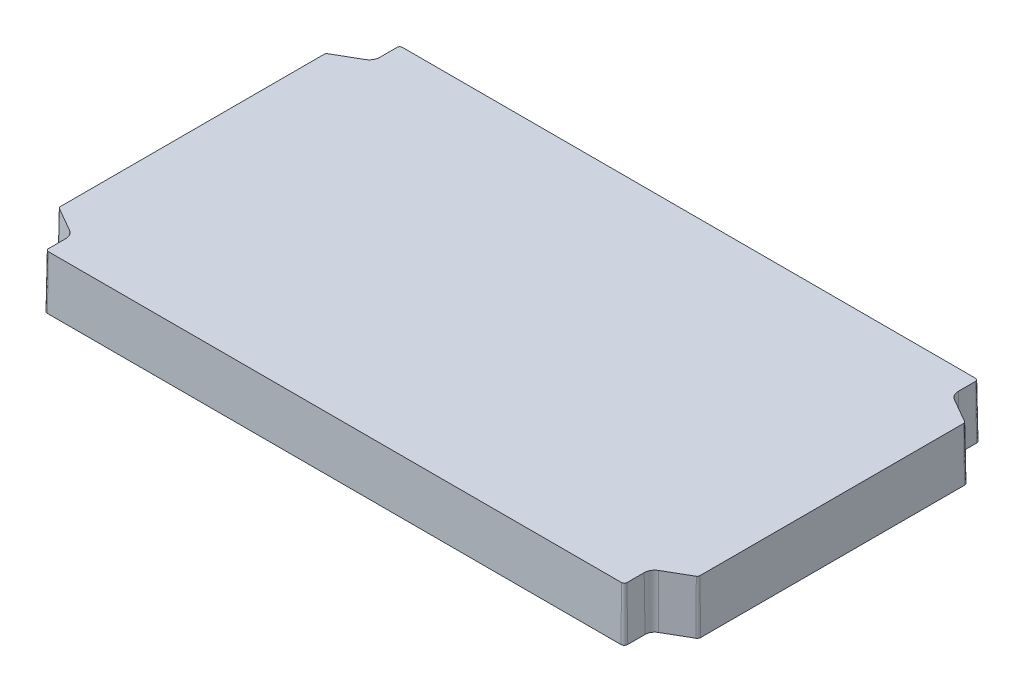
ISO-10303-21;
HEADER;
FILE_DESCRIPTION(('STEP AP214'),'2;1');
FILE_NAME('part.step','',(''),(''),'','','');
FILE_SCHEMA(('AUTOMOTIVE_DESIGN { 1 0 10303 214 1 1 1 1 }'));
ENDSEC;
DATA;
#1=APPLICATION_CONTEXT('core data for automotive mechanical design processes');
#2=APPLICATION_PROTOCOL_DEFINITION('international standard','automotive_design',2000,#1);
#3=PRODUCT_CONTEXT('',#1,'mechanical');
#4=PRODUCT('Part','Part','',(#3));
#5=PRODUCT_RELATED_PRODUCT_CATEGORY('part','',(#4));
#6=PRODUCT_DEFINITION_FORMATION('','',#4);
#7=PRODUCT_DEFINITION_CONTEXT('part definition',#1,'design');
#8=PRODUCT_DEFINITION('design','',#6,#7);
#9=PRODUCT_DEFINITION_SHAPE('','',#8);
#10=(LENGTH_UNIT() NAMED_UNIT(*) SI_UNIT(.MILLI.,.METRE.));
#11=(NAMED_UNIT(*) PLANE_ANGLE_UNIT() SI_UNIT($,.RADIAN.));
#12=(NAMED_UNIT(*) SI_UNIT($,.STERADIAN.) SOLID_ANGLE_UNIT());
#13=UNCERTAINTY_MEASURE_WITH_UNIT(LENGTH_MEASURE(1.E-05),#10,'distance_accuracy_value','');
#14=(GEOMETRIC_REPRESENTATION_CONTEXT(3) GLOBAL_UNCERTAINTY_ASSIGNED_CONTEXT((#13)) GLOBAL_UNIT_ASSIGNED_CONTEXT((#10,
#11,#12)) REPRESENTATION_CONTEXT('',''));
#15=CARTESIAN_POINT('',(0.,0.,0.));
#16=DIRECTION('',(0.,0.,1.));
#17=DIRECTION('',(1.,0.,0.));
#18=AXIS2_PLACEMENT_3D('',#15,#16,#17);
#19=CARTESIAN_POINT('',(134.996749371851,-37.5520685347959,82.1212644756854));
#20=DIRECTION('',(0.,-1.,0.));
#21=DIRECTION('',(0.,0.,-1.));
#22=AXIS2_PLACEMENT_3D('',#19,#20,#21);
#23=CONICAL_SURFACE('',#22,1.21452207822979,0.017453292519956);
#24=CARTESIAN_POINT('',(134.996749371851,-37.5520685347959,82.1212644756854));
#25=DIRECTION('',(0.,1.,0.));
#26=DIRECTION('',(0.,0.,-1.));
#27=AXIS2_PLACEMENT_3D('',#24,#25,#26);
#28=CIRCLE('',#27,1.21452207822979);
#29=CARTESIAN_POINT('',(134.996749371851,-37.5520685347959,83.3357865539152));
#30=VERTEX_POINT('',#29);
#31=CARTESIAN_POINT('',(136.211271450081,-37.5520685347959,82.1212644756854));
#32=VERTEX_POINT('',#31);
#33=EDGE_CURVE('E239',#30,#32,#28,.T.);
#34=ORIENTED_EDGE('',*,*,#33,.F.);
#35=DIRECTION('',(0.,-0.999847695156391,0.0174524064372962));
#36=VECTOR('',#35,1.);
#37=CARTESIAN_POINT('',(134.996749371851,-37.5520685347959,83.3357865539152));
#38=LINE('',#37,#36);
#39=CARTESIAN_POINT('',(134.996749371851,-62.5520685348215,83.7721631771214));
#40=VERTEX_POINT('',#39);
#41=EDGE_CURVE('E11',#40,#30,#38,.F.);
#42=ORIENTED_EDGE('',*,*,#41,.F.);
#43=CARTESIAN_POINT('',(134.996749371851,-62.5520685348215,82.1212644756854));
#44=DIRECTION('',(0.,-1.,0.));
#45=DIRECTION('',(0.,0.,-1.));
#46=AXIS2_PLACEMENT_3D('',#43,#44,#45);
#47=CIRCLE('',#46,1.65089870143599);
#48=CARTESIAN_POINT('',(136.647648073287,-62.5520685348215,82.1212644756854));
#49=VERTEX_POINT('',#48);
#50=EDGE_CURVE('E241',#40,#49,#47,.F.);
#51=ORIENTED_EDGE('',*,*,#50,.T.);
#52=DIRECTION('',(0.0174524064372962,-0.999847695156391,0.));
#53=VECTOR('',#52,1.);
#54=CARTESIAN_POINT('',(136.211271450081,-37.5520685347959,82.1212644756854));
#55=LINE('',#54,#53);
#56=EDGE_CURVE('E157',#49,#32,#55,.F.);
#57=ORIENTED_EDGE('',*,*,#56,.T.);
#58=EDGE_LOOP('',(#34,#42,#51,#57));
#59=FACE_BOUND('',#58,.T.);
#60=ADVANCED_FACE('F49',(#59),#23,.T.);
#61=CARTESIAN_POINT('',(-134.996749371851,-37.5520685347959,83.3357865539152));
#62=DIRECTION('',(0.,0.0174524064372962,0.999847695156391));
#63=DIRECTION('',(0.,-0.999847695156391,0.0174524064372962));
#64=AXIS2_PLACEMENT_3D('',#61,#62,#63);
#65=PLANE('',#64);
#66=DIRECTION('',(1.,0.,0.));
#67=VECTOR('',#66,1.);
#68=CARTESIAN_POINT('',(-134.996749371851,-37.5520685347959,83.3357865539152));
#69=LINE('',#68,#67);
#70=CARTESIAN_POINT('',(-134.996749371851,-37.5520685347959,83.3357865539152));
#71=VERTEX_POINT('',#70);
#72=EDGE_CURVE('E254',#71,#30,#69,.T.);
#73=ORIENTED_EDGE('',*,*,#72,.F.);
#74=DIRECTION('',(0.,-0.999847695156391,0.0174524064372962));
#75=VECTOR('',#74,1.);
#76=CARTESIAN_POINT('',(-134.996749371851,-37.5520685347959,83.3357865539152));
#77=LINE('',#76,#75);
#78=CARTESIAN_POINT('',(-134.996749371851,-62.5520685348215,83.7721631771214));
#79=VERTEX_POINT('',#78);
#80=EDGE_CURVE('E53',#79,#71,#77,.F.);
#81=ORIENTED_EDGE('',*,*,#80,.F.);
#82=DIRECTION('',(1.,0.,0.));
#83=VECTOR('',#82,1.);
#84=CARTESIAN_POINT('',(-134.996749371851,-62.5520685348215,83.7721631771214));
#85=LINE('',#84,#83);
#86=EDGE_CURVE('E243',#79,#40,#85,.T.);
#87=ORIENTED_EDGE('',*,*,#86,.T.);
#88=ORIENTED_EDGE('',*,*,#41,.T.);
#89=EDGE_LOOP('',(#73,#81,#87,#88));
#90=FACE_BOUND('',#89,.T.);
#91=ADVANCED_FACE('F51',(#90),#65,.T.);
#92=CARTESIAN_POINT('',(-134.996749371851,-37.5520685347959,82.1212644756855));
#93=DIRECTION('',(0.,-1.,0.));
#94=DIRECTION('',(0.,0.,1.));
#95=AXIS2_PLACEMENT_3D('',#92,#93,#94);
#96=CONICAL_SURFACE('',#95,1.21452207822979,0.017453292519956);
#97=CARTESIAN_POINT('',(-134.996749371851,-37.5520685347959,82.1212644756855));
#98=DIRECTION('',(0.,1.,0.));
#99=DIRECTION('',(0.,0.,1.));
#100=AXIS2_PLACEMENT_3D('',#97,#98,#99);
#101=CIRCLE('',#100,1.21452207822979);
#102=CARTESIAN_POINT('',(-136.211271450081,-37.5520685347959,82.1212644756855));
#103=VERTEX_POINT('',#102);
#104=EDGE_CURVE('E336',#103,#71,#101,.T.);
#105=ORIENTED_EDGE('',*,*,#104,.F.);
#106=DIRECTION('',(-0.0174524064372962,-0.999847695156391,0.));
#107=VECTOR('',#106,1.);
#108=CARTESIAN_POINT('',(-136.211271450081,-37.5520685347959,82.1212644756855));
#109=LINE('',#108,#107);
#110=CARTESIAN_POINT('',(-136.647648073287,-62.5520685348215,82.1212644756855));
#111=VERTEX_POINT('',#110);
#112=EDGE_CURVE('E488',#111,#103,#109,.F.);
#113=ORIENTED_EDGE('',*,*,#112,.F.);
#114=CARTESIAN_POINT('',(-134.996749371851,-62.5520685348215,82.1212644756855));
#115=DIRECTION('',(0.,-1.,0.));
#116=DIRECTION('',(0.,0.,-1.));
#117=AXIS2_PLACEMENT_3D('',#114,#115,#116);
#118=CIRCLE('',#117,1.65089870143599);
#119=EDGE_CURVE('E346',#111,#79,#118,.F.);
#120=ORIENTED_EDGE('',*,*,#119,.T.);
#121=ORIENTED_EDGE('',*,*,#80,.T.);
#122=EDGE_LOOP('',(#105,#113,#120,#121));
#123=FACE_BOUND('',#122,.T.);
#124=ADVANCED_FACE('F496',(#123),#96,.T.);
#125=CARTESIAN_POINT('',(-136.211271450081,-37.5520685347959,73.9747215204799));
#126=DIRECTION('',(-0.999847695156391,0.0174524064372962,0.));
#127=DIRECTION('',(-0.0174524064372962,-0.999847695156391,0.));
#128=AXIS2_PLACEMENT_3D('',#125,#126,#127);
#129=PLANE('',#128);
#130=DIRECTION('',(0.,0.,1.));
#131=VECTOR('',#130,1.);
#132=CARTESIAN_POINT('',(-136.211271450081,-37.5520685347959,73.9747215204799));
#133=LINE('',#132,#131);
#134=CARTESIAN_POINT('',(-136.211271450081,-37.5520685347959,73.9747215204799));
#135=VERTEX_POINT('',#134);
#136=EDGE_CURVE('E332',#135,#103,#133,.T.);
#137=ORIENTED_EDGE('',*,*,#136,.F.);
#138=DIRECTION('',(-0.0174524064372962,-0.999847695156391,0.));
#139=VECTOR('',#138,1.);
#140=CARTESIAN_POINT('',(-136.211271450081,-37.5520685347959,73.9747215204799));
#141=LINE('',#140,#139);
#142=CARTESIAN_POINT('',(-136.647648073287,-62.5520685348215,73.9747215204799));
#143=VERTEX_POINT('',#142);
#144=EDGE_CURVE('E486',#143,#135,#141,.F.);
#145=ORIENTED_EDGE('',*,*,#144,.F.);
#146=DIRECTION('',(0.,0.,1.));
#147=VECTOR('',#146,1.);
#148=CARTESIAN_POINT('',(-136.647648073287,-62.5520685348215,73.9747215204799));
#149=LINE('',#148,#147);
#150=EDGE_CURVE('E349',#143,#111,#149,.T.);
#151=ORIENTED_EDGE('',*,*,#150,.T.);
#152=ORIENTED_EDGE('',*,*,#112,.T.);
#153=EDGE_LOOP('',(#137,#145,#151,#152));
#154=FACE_BOUND('',#153,.T.);
#155=ADVANCED_FACE('F493',(#154),#129,.T.);
#156=CARTESIAN_POINT('',(-141.194748953033,-37.5520685347959,73.9747215204799));
#157=DIRECTION('',(0.,1.,0.));
#158=DIRECTION('',(0.,0.,-1.));
#159=AXIS2_PLACEMENT_3D('',#156,#157,#158);
#160=CONICAL_SURFACE('',#159,4.98347750295221,0.017453292519956);
#161=CARTESIAN_POINT('',(-141.194748953033,-37.5520685347959,73.9747215204799));
#162=DIRECTION('',(0.,-1.,0.));
#163=DIRECTION('',(0.,0.,-1.));
#164=AXIS2_PLACEMENT_3D('',#161,#162,#163);
#165=CIRCLE('',#164,4.98347750295221);
#166=CARTESIAN_POINT('',(-138.703010201557,-37.5520685347959,69.6589034037349));
#167=VERTEX_POINT('',#166);
#168=EDGE_CURVE('E328',#167,#135,#165,.T.);
#169=ORIENTED_EDGE('',*,*,#168,.F.);
#170=DIRECTION('',(-0.00872620321864806,-0.999847695156391,0.0151142273318696));
#171=VECTOR('',#170,1.);
#172=CARTESIAN_POINT('',(-138.703010201557,-37.5520685347959,69.6589034037349));
#173=LINE('',#172,#171);
#174=CARTESIAN_POINT('',(-138.92119851316,-62.5520685348215,70.0368166450491));
#175=VERTEX_POINT('',#174);
#176=EDGE_CURVE('E483',#175,#167,#173,.F.);
#177=ORIENTED_EDGE('',*,*,#176,.F.);
#178=CARTESIAN_POINT('',(-141.194748953033,-62.5520685348215,73.9747215204799));
#179=DIRECTION('',(0.,-1.,0.));
#180=DIRECTION('',(0.,0.,-1.));
#181=AXIS2_PLACEMENT_3D('',#178,#179,#180);
#182=CIRCLE('',#181,4.54710087974601);
#183=EDGE_CURVE('E353',#175,#143,#182,.T.);
#184=ORIENTED_EDGE('',*,*,#183,.T.);
#185=ORIENTED_EDGE('',*,*,#144,.T.);
#186=EDGE_LOOP('',(#169,#177,#184,#185));
#187=FACE_BOUND('',#186,.T.);
#188=ADVANCED_FACE('F500',(#187),#160,.F.);
#189=CARTESIAN_POINT('',(-149.952533386026,-37.5520685347959,63.1639881649269));
#190=DIRECTION('',(-0.499923847578194,0.0174524064372962,0.865893503920755));
#191=DIRECTION('',(0.86602540378444,0.,0.499999999999998));
#192=AXIS2_PLACEMENT_3D('',#189,#190,#191);
#193=PLANE('',#192);
#194=DIRECTION('',(0.86602540378444,0.,0.499999999999998));
#195=VECTOR('',#194,1.);
#196=CARTESIAN_POINT('',(-149.952533386026,-37.5520685347959,63.1639881649269));
#197=LINE('',#196,#195);
#198=CARTESIAN_POINT('',(-149.952533386026,-37.5520685347959,63.1639881649269));
#199=VERTEX_POINT('',#198);
#200=EDGE_CURVE('E324',#199,#167,#197,.T.);
#201=ORIENTED_EDGE('',*,*,#200,.F.);
#202=DIRECTION('',(-0.00872620321864867,-0.999847695156391,0.0151142273318692));
#203=VECTOR('',#202,1.);
#204=CARTESIAN_POINT('',(-149.952533386026,-37.5520685347959,63.1639881649269));
#205=LINE('',#204,#203);
#206=CARTESIAN_POINT('',(-150.170721697629,-62.5520685348215,63.5419014062412));
#207=VERTEX_POINT('',#206);
#208=EDGE_CURVE('E480',#207,#199,#205,.F.);
#209=ORIENTED_EDGE('',*,*,#208,.F.);
#210=DIRECTION('',(0.86602540378444,0.,0.499999999999998));
#211=VECTOR('',#210,1.);
#212=CARTESIAN_POINT('',(-150.170721697629,-62.5520685348215,63.5419014062411));
#213=LINE('',#212,#211);
#214=EDGE_CURVE('E357',#207,#175,#213,.T.);
#215=ORIENTED_EDGE('',*,*,#214,.T.);
#216=ORIENTED_EDGE('',*,*,#176,.T.);
#217=EDGE_LOOP('',(#201,#209,#215,#216));
#218=FACE_BOUND('',#217,.T.);
#219=ADVANCED_FACE('F585',(#218),#193,.T.);
#220=CARTESIAN_POINT('',(-149.345272346911,-37.5520685347959,62.1121811917229));
#221=DIRECTION('',(0.,-1.,0.));
#222=DIRECTION('',(0.,0.,1.));
#223=AXIS2_PLACEMENT_3D('',#220,#221,#222);
#224=CONICAL_SURFACE('',#223,1.21452207822972,0.017453292519956);
#225=CARTESIAN_POINT('',(-149.345272346911,-37.5520685347959,62.1121811917229));
#226=DIRECTION('',(0.,1.,0.));
#227=DIRECTION('',(0.,0.,1.));
#228=AXIS2_PLACEMENT_3D('',#225,#226,#227);
#229=CIRCLE('',#228,1.21452207822972);
#230=CARTESIAN_POINT('',(-150.559794425141,-37.5520685347959,62.1121811917228));
#231=VERTEX_POINT('',#230);
#232=EDGE_CURVE('E320',#231,#199,#229,.T.);
#233=ORIENTED_EDGE('',*,*,#232,.F.);
#234=DIRECTION('',(-0.0174524064372962,-0.999847695156391,0.));
#235=VECTOR('',#234,1.);
#236=CARTESIAN_POINT('',(-150.559794425141,-37.5520685347959,62.1121811917228));
#237=LINE('',#236,#235);
#238=CARTESIAN_POINT('',(-150.996171048347,-62.5520685348215,62.1121811917228));
#239=VERTEX_POINT('',#238);
#240=EDGE_CURVE('E477',#239,#231,#237,.F.);
#241=ORIENTED_EDGE('',*,*,#240,.F.);
#242=CARTESIAN_POINT('',(-149.345272346911,-62.5520685348215,62.1121811917229));
#243=DIRECTION('',(0.,-1.,0.));
#244=DIRECTION('',(0.,0.,-1.));
#245=AXIS2_PLACEMENT_3D('',#242,#243,#244);
#246=CIRCLE('',#245,1.65089870143593);
#247=EDGE_CURVE('E361',#239,#207,#246,.F.);
#248=ORIENTED_EDGE('',*,*,#247,.T.);
#249=ORIENTED_EDGE('',*,*,#208,.T.);
#250=EDGE_LOOP('',(#233,#241,#248,#249));
#251=FACE_BOUND('',#250,.T.);
#252=ADVANCED_FACE('F581',(#251),#224,.T.);
#253=CARTESIAN_POINT('',(-150.559794425141,-37.5520685347959,-62.1121811917228));
#254=DIRECTION('',(-0.999847695156391,0.0174524064372962,0.));
#255=DIRECTION('',(-0.0174524064372962,-0.999847695156391,0.));
#256=AXIS2_PLACEMENT_3D('',#253,#254,#255);
#257=PLANE('',#256);
#258=DIRECTION('',(0.,0.,1.));
#259=VECTOR('',#258,1.);
#260=CARTESIAN_POINT('',(-150.559794425141,-37.5520685347959,-62.1121811917228));
#261=LINE('',#260,#259);
#262=CARTESIAN_POINT('',(-150.559794425141,-37.5520685347959,-62.1121811917228));
#263=VERTEX_POINT('',#262);
#264=EDGE_CURVE('E316',#263,#231,#261,.T.);
#265=ORIENTED_EDGE('',*,*,#264,.F.);
#266=DIRECTION('',(-0.0174524064372962,-0.999847695156391,0.));
#267=VECTOR('',#266,1.);
#268=CARTESIAN_POINT('',(-150.559794425141,-37.5520685347959,-62.1121811917228));
#269=LINE('',#268,#267);
#270=CARTESIAN_POINT('',(-150.996171048347,-62.5520685348215,-62.1121811917227));
#271=VERTEX_POINT('',#270);
#272=EDGE_CURVE('E474',#271,#263,#269,.F.);
#273=ORIENTED_EDGE('',*,*,#272,.F.);
#274=DIRECTION('',(0.,0.,1.));
#275=VECTOR('',#274,1.);
#276=CARTESIAN_POINT('',(-150.996171048347,-62.5520685348215,-62.1121811917228));
#277=LINE('',#276,#275);
#278=EDGE_CURVE('E365',#271,#239,#277,.T.);
#279=ORIENTED_EDGE('',*,*,#278,.T.);
#280=ORIENTED_EDGE('',*,*,#240,.T.);
#281=EDGE_LOOP('',(#265,#273,#279,#280));
#282=FACE_BOUND('',#281,.T.);
#283=ADVANCED_FACE('F577',(#282),#257,.T.);
#284=CARTESIAN_POINT('',(-149.345272346911,-37.5520685347959,-62.1121811917229));
#285=DIRECTION('',(0.,-1.,0.));
#286=DIRECTION('',(0.,0.,-1.));
#287=AXIS2_PLACEMENT_3D('',#284,#285,#286);
#288=CONICAL_SURFACE('',#287,1.21452207822972,0.017453292519956);
#289=CARTESIAN_POINT('',(-149.345272346911,-37.5520685347959,-62.1121811917229));
#290=DIRECTION('',(0.,1.,0.));
#291=DIRECTION('',(0.,0.,-1.));
#292=AXIS2_PLACEMENT_3D('',#289,#290,#291);
#293=CIRCLE('',#292,1.21452207822972);
#294=CARTESIAN_POINT('',(-149.952533386026,-37.5520685347959,-63.1639881649269));
#295=VERTEX_POINT('',#294);
#296=EDGE_CURVE('E312',#295,#263,#293,.T.);
#297=ORIENTED_EDGE('',*,*,#296,.F.);
#298=DIRECTION('',(-0.00872620321864809,-0.999847695156391,-0.0151142273318696));
#299=VECTOR('',#298,1.);
#300=CARTESIAN_POINT('',(-149.952533386026,-37.5520685347959,-63.1639881649269));
#301=LINE('',#300,#299);
#302=CARTESIAN_POINT('',(-150.170721697629,-62.5520685348215,-63.5419014062411));
#303=VERTEX_POINT('',#302);
#304=EDGE_CURVE('E471',#303,#295,#301,.F.);
#305=ORIENTED_EDGE('',*,*,#304,.F.);
#306=CARTESIAN_POINT('',(-149.345272346911,-62.5520685348215,-62.1121811917229));
#307=DIRECTION('',(0.,-1.,0.));
#308=DIRECTION('',(0.,0.,-1.));
#309=AXIS2_PLACEMENT_3D('',#306,#307,#308);
#310=CIRCLE('',#309,1.65089870143592);
#311=EDGE_CURVE('E369',#303,#271,#310,.F.);
#312=ORIENTED_EDGE('',*,*,#311,.T.);
#313=ORIENTED_EDGE('',*,*,#272,.T.);
#314=EDGE_LOOP('',(#297,#305,#312,#313));
#315=FACE_BOUND('',#314,.T.);
#316=ADVANCED_FACE('F573',(#315),#288,.T.);
#317=CARTESIAN_POINT('',(-149.952533386026,-37.5520685347959,-63.1639881649269));
#318=DIRECTION('',(-0.499923847578195,0.0174524064372962,-0.865893503920754));
#319=DIRECTION('',(-0.866025403784439,0.,0.5));
#320=AXIS2_PLACEMENT_3D('',#317,#318,#319);
#321=PLANE('',#320);
#322=DIRECTION('',(-0.866025403784439,0.,0.5));
#323=VECTOR('',#322,1.);
#324=CARTESIAN_POINT('',(-149.952533386026,-37.5520685347959,-63.1639881649269));
#325=LINE('',#324,#323);
#326=CARTESIAN_POINT('',(-138.703010201557,-37.5520685347959,-69.6589034037349));
#327=VERTEX_POINT('',#326);
#328=EDGE_CURVE('E308',#327,#295,#325,.T.);
#329=ORIENTED_EDGE('',*,*,#328,.F.);
#330=DIRECTION('',(-0.0087262032186475,-0.999847695156391,-0.0151142273318699));
#331=VECTOR('',#330,1.);
#332=CARTESIAN_POINT('',(-138.703010201557,-37.5520685347959,-69.6589034037349));
#333=LINE('',#332,#331);
#334=CARTESIAN_POINT('',(-138.92119851316,-62.5520685348215,-70.0368166450492));
#335=VERTEX_POINT('',#334);
#336=EDGE_CURVE('E468',#335,#327,#333,.F.);
#337=ORIENTED_EDGE('',*,*,#336,.F.);
#338=DIRECTION('',(-0.866025403784439,0.,0.5));
#339=VECTOR('',#338,1.);
#340=CARTESIAN_POINT('',(-150.170721697629,-62.5520685348215,-63.5419014062411));
#341=LINE('',#340,#339);
#342=EDGE_CURVE('E373',#335,#303,#341,.T.);
#343=ORIENTED_EDGE('',*,*,#342,.T.);
#344=ORIENTED_EDGE('',*,*,#304,.T.);
#345=EDGE_LOOP('',(#329,#337,#343,#344));
#346=FACE_BOUND('',#345,.T.);
#347=ADVANCED_FACE('F569',(#346),#321,.T.);
#348=CARTESIAN_POINT('',(-141.194748953033,-37.5520685347959,-73.9747215204799));
#349=DIRECTION('',(0.,1.,0.));
#350=DIRECTION('',(0.,0.,1.));
#351=AXIS2_PLACEMENT_3D('',#348,#349,#350);
#352=CONICAL_SURFACE('',#351,4.9834775029522,0.017453292519956);
#353=CARTESIAN_POINT('',(-141.194748953033,-37.5520685347959,-73.9747215204799));
#354=DIRECTION('',(0.,-1.,0.));
#355=DIRECTION('',(0.,0.,1.));
#356=AXIS2_PLACEMENT_3D('',#353,#354,#355);
#357=CIRCLE('',#356,4.9834775029522);
#358=CARTESIAN_POINT('',(-136.211271450081,-37.5520685347959,-73.9747215204799));
#359=VERTEX_POINT('',#358);
#360=EDGE_CURVE('E304',#359,#327,#357,.T.);
#361=ORIENTED_EDGE('',*,*,#360,.F.);
#362=DIRECTION('',(-0.0174524064372962,-0.999847695156391,0.));
#363=VECTOR('',#362,1.);
#364=CARTESIAN_POINT('',(-136.211271450081,-37.5520685347959,-73.9747215204799));
#365=LINE('',#364,#363);
#366=CARTESIAN_POINT('',(-136.647648073287,-62.5520685348215,-73.9747215204799));
#367=VERTEX_POINT('',#366);
#368=EDGE_CURVE('E465',#367,#359,#365,.F.);
#369=ORIENTED_EDGE('',*,*,#368,.F.);
#370=CARTESIAN_POINT('',(-141.194748953033,-62.5520685348215,-73.9747215204799));
#371=DIRECTION('',(0.,-1.,0.));
#372=DIRECTION('',(0.,0.,-1.));
#373=AXIS2_PLACEMENT_3D('',#370,#371,#372);
#374=CIRCLE('',#373,4.547100879746);
#375=EDGE_CURVE('E377',#367,#335,#374,.T.);
#376=ORIENTED_EDGE('',*,*,#375,.T.);
#377=ORIENTED_EDGE('',*,*,#336,.T.);
#378=EDGE_LOOP('',(#361,#369,#376,#377));
#379=FACE_BOUND('',#378,.T.);
#380=ADVANCED_FACE('F565',(#379),#352,.F.);
#381=CARTESIAN_POINT('',(-136.211271450081,-37.5520685347959,-73.9747215204799));
#382=DIRECTION('',(-0.999847695156391,0.0174524064372962,0.));
#383=DIRECTION('',(-0.0174524064372962,-0.999847695156391,0.));
#384=AXIS2_PLACEMENT_3D('',#381,#382,#383);
#385=PLANE('',#384);
#386=DIRECTION('',(0.,0.,1.));
#387=VECTOR('',#386,1.);
#388=CARTESIAN_POINT('',(-136.211271450081,-37.5520685347959,-73.9747215204799));
#389=LINE('',#388,#387);
#390=CARTESIAN_POINT('',(-136.211271450081,-37.5520685347959,-82.1212644756855));
#391=VERTEX_POINT('',#390);
#392=EDGE_CURVE('E300',#391,#359,#389,.T.);
#393=ORIENTED_EDGE('',*,*,#392,.F.);
#394=DIRECTION('',(-0.0174524064372962,-0.999847695156391,0.));
#395=VECTOR('',#394,1.);
#396=CARTESIAN_POINT('',(-136.211271450081,-37.5520685347959,-82.1212644756855));
#397=LINE('',#396,#395);
#398=CARTESIAN_POINT('',(-136.647648073287,-62.5520685348215,-82.1212644756855));
#399=VERTEX_POINT('',#398);
#400=EDGE_CURVE('E462',#399,#391,#397,.F.);
#401=ORIENTED_EDGE('',*,*,#400,.F.);
#402=DIRECTION('',(0.,0.,1.));
#403=VECTOR('',#402,1.);
#404=CARTESIAN_POINT('',(-136.647648073287,-62.5520685348215,-73.9747215204799));
#405=LINE('',#404,#403);
#406=EDGE_CURVE('E381',#399,#367,#405,.T.);
#407=ORIENTED_EDGE('',*,*,#406,.T.);
#408=ORIENTED_EDGE('',*,*,#368,.T.);
#409=EDGE_LOOP('',(#393,#401,#407,#408));
#410=FACE_BOUND('',#409,.T.);
#411=ADVANCED_FACE('F561',(#410),#385,.T.);
#412=CARTESIAN_POINT('',(-134.996749371851,-37.5520685347959,-82.1212644756855));
#413=DIRECTION('',(0.,-1.,0.));
#414=DIRECTION('',(0.,0.,-1.));
#415=AXIS2_PLACEMENT_3D('',#412,#413,#414);
#416=CONICAL_SURFACE('',#415,1.21452207822979,0.017453292519956);
#417=CARTESIAN_POINT('',(-134.996749371851,-37.5520685347959,-82.1212644756855));
#418=DIRECTION('',(0.,1.,0.));
#419=DIRECTION('',(0.,0.,-1.));
#420=AXIS2_PLACEMENT_3D('',#417,#418,#419);
#421=CIRCLE('',#420,1.21452207822979);
#422=CARTESIAN_POINT('',(-134.996749371851,-37.5520685347959,-83.3357865539152));
#423=VERTEX_POINT('',#422);
#424=EDGE_CURVE('E296',#423,#391,#421,.T.);
#425=ORIENTED_EDGE('',*,*,#424,.F.);
#426=DIRECTION('',(0.,-0.999847695156391,-0.0174524064372962));
#427=VECTOR('',#426,1.);
#428=CARTESIAN_POINT('',(-134.996749371851,-37.5520685347959,-83.3357865539152));
#429=LINE('',#428,#427);
#430=CARTESIAN_POINT('',(-134.996749371851,-62.5520685348215,-83.7721631771214));
#431=VERTEX_POINT('',#430);
#432=EDGE_CURVE('E459',#431,#423,#429,.F.);
#433=ORIENTED_EDGE('',*,*,#432,.F.);
#434=CARTESIAN_POINT('',(-134.996749371851,-62.5520685348215,-82.1212644756855));
#435=DIRECTION('',(0.,-1.,0.));
#436=DIRECTION('',(0.,0.,-1.));
#437=AXIS2_PLACEMENT_3D('',#434,#435,#436);
#438=CIRCLE('',#437,1.65089870143599);
#439=EDGE_CURVE('E385',#431,#399,#438,.F.);
#440=ORIENTED_EDGE('',*,*,#439,.T.);
#441=ORIENTED_EDGE('',*,*,#400,.T.);
#442=EDGE_LOOP('',(#425,#433,#440,#441));
#443=FACE_BOUND('',#442,.T.);
#444=ADVANCED_FACE('F557',(#443),#416,.T.);
#445=CARTESIAN_POINT('',(-134.996749371851,-37.5520685347959,-83.3357865539152));
#446=DIRECTION('',(0.,0.0174524064372962,-0.999847695156391));
#447=DIRECTION('',(0.,0.999847695156391,0.0174524064372962));
#448=AXIS2_PLACEMENT_3D('',#445,#446,#447);
#449=PLANE('',#448);
#450=DIRECTION('',(-1.,0.,0.));
#451=VECTOR('',#450,1.);
#452=CARTESIAN_POINT('',(-134.996749371851,-37.5520685347959,-83.3357865539152));
#453=LINE('',#452,#451);
#454=CARTESIAN_POINT('',(134.996749371851,-37.5520685347959,-83.3357865539152));
#455=VERTEX_POINT('',#454);
#456=EDGE_CURVE('E292',#455,#423,#453,.T.);
#457=ORIENTED_EDGE('',*,*,#456,.F.);
#458=DIRECTION('',(0.,-0.999847695156391,-0.0174524064372962));
#459=VECTOR('',#458,1.);
#460=CARTESIAN_POINT('',(134.996749371851,-37.5520685347959,-83.3357865539152));
#461=LINE('',#460,#459);
#462=CARTESIAN_POINT('',(134.996749371851,-62.5520685348215,-83.7721631771214));
#463=VERTEX_POINT('',#462);
#464=EDGE_CURVE('E456',#463,#455,#461,.F.);
#465=ORIENTED_EDGE('',*,*,#464,.F.);
#466=DIRECTION('',(-1.,0.,0.));
#467=VECTOR('',#466,1.);
#468=CARTESIAN_POINT('',(-134.996749371851,-62.5520685348215,-83.7721631771214));
#469=LINE('',#468,#467);
#470=EDGE_CURVE('E389',#463,#431,#469,.T.);
#471=ORIENTED_EDGE('',*,*,#470,.T.);
#472=ORIENTED_EDGE('',*,*,#432,.T.);
#473=EDGE_LOOP('',(#457,#465,#471,#472));
#474=FACE_BOUND('',#473,.T.);
#475=ADVANCED_FACE('F553',(#474),#449,.T.);
#476=CARTESIAN_POINT('',(134.996749371851,-37.5520685347959,-82.1212644756854));
#477=DIRECTION('',(0.,-1.,0.));
#478=DIRECTION('',(0.,0.,1.));
#479=AXIS2_PLACEMENT_3D('',#476,#477,#478);
#480=CONICAL_SURFACE('',#479,1.21452207822979,0.017453292519956);
#481=CARTESIAN_POINT('',(134.996749371851,-37.5520685347959,-82.1212644756854));
#482=DIRECTION('',(0.,1.,0.));
#483=DIRECTION('',(0.,0.,1.));
#484=AXIS2_PLACEMENT_3D('',#481,#482,#483);
#485=CIRCLE('',#484,1.21452207822979);
#486=CARTESIAN_POINT('',(136.211271450081,-37.5520685347959,-82.1212644756854));
#487=VERTEX_POINT('',#486);
#488=EDGE_CURVE('E288',#487,#455,#485,.T.);
#489=ORIENTED_EDGE('',*,*,#488,.F.);
#490=DIRECTION('',(0.0174524064372962,-0.999847695156391,0.));
#491=VECTOR('',#490,1.);
#492=CARTESIAN_POINT('',(136.211271450081,-37.5520685347959,-82.1212644756854));
#493=LINE('',#492,#491);
#494=CARTESIAN_POINT('',(136.647648073287,-62.5520685348215,-82.1212644756854));
#495=VERTEX_POINT('',#494);
#496=EDGE_CURVE('E453',#495,#487,#493,.F.);
#497=ORIENTED_EDGE('',*,*,#496,.F.);
#498=CARTESIAN_POINT('',(134.996749371851,-62.5520685348215,-82.1212644756854));
#499=DIRECTION('',(0.,-1.,0.));
#500=DIRECTION('',(0.,0.,-1.));
#501=AXIS2_PLACEMENT_3D('',#498,#499,#500);
#502=CIRCLE('',#501,1.65089870143599);
#503=EDGE_CURVE('E393',#495,#463,#502,.F.);
#504=ORIENTED_EDGE('',*,*,#503,.T.);
#505=ORIENTED_EDGE('',*,*,#464,.T.);
#506=EDGE_LOOP('',(#489,#497,#504,#505));
#507=FACE_BOUND('',#506,.T.);
#508=ADVANCED_FACE('F549',(#507),#480,.T.);
#509=CARTESIAN_POINT('',(136.211271450081,-37.5520685347959,-73.9747215204798));
#510=DIRECTION('',(0.999847695156391,0.0174524064372962,0.));
#511=DIRECTION('',(-0.0174524064372962,0.999847695156391,0.));
#512=AXIS2_PLACEMENT_3D('',#509,#510,#511);
#513=PLANE('',#512);
#514=DIRECTION('',(0.,0.,-1.));
#515=VECTOR('',#514,1.);
#516=CARTESIAN_POINT('',(136.211271450081,-37.5520685347959,-73.9747215204798));
#517=LINE('',#516,#515);
#518=CARTESIAN_POINT('',(136.211271450081,-37.5520685347959,-73.9747215204798));
#519=VERTEX_POINT('',#518);
#520=EDGE_CURVE('E284',#519,#487,#517,.T.);
#521=ORIENTED_EDGE('',*,*,#520,.F.);
#522=DIRECTION('',(0.0174524064372962,-0.999847695156391,0.));
#523=VECTOR('',#522,1.);
#524=CARTESIAN_POINT('',(136.211271450081,-37.5520685347959,-73.9747215204798));
#525=LINE('',#524,#523);
#526=CARTESIAN_POINT('',(136.647648073287,-62.5520685348215,-73.9747215204798));
#527=VERTEX_POINT('',#526);
#528=EDGE_CURVE('E450',#527,#519,#525,.F.);
#529=ORIENTED_EDGE('',*,*,#528,.F.);
#530=DIRECTION('',(0.,0.,-1.));
#531=VECTOR('',#530,1.);
#532=CARTESIAN_POINT('',(136.647648073287,-62.5520685348215,-73.9747215204798));
#533=LINE('',#532,#531);
#534=EDGE_CURVE('E397',#527,#495,#533,.T.);
#535=ORIENTED_EDGE('',*,*,#534,.T.);
#536=ORIENTED_EDGE('',*,*,#496,.T.);
#537=EDGE_LOOP('',(#521,#529,#535,#536));
#538=FACE_BOUND('',#537,.T.);
#539=ADVANCED_FACE('F545',(#538),#513,.T.);
#540=CARTESIAN_POINT('',(141.194748953033,-37.5520685347959,-73.9747215204798));
#541=DIRECTION('',(0.,1.,0.));
#542=DIRECTION('',(0.,0.,-1.));
#543=AXIS2_PLACEMENT_3D('',#540,#541,#542);
#544=CONICAL_SURFACE('',#543,4.98347750295222,0.017453292519956);
#545=CARTESIAN_POINT('',(141.194748953033,-37.5520685347959,-73.9747215204798));
#546=DIRECTION('',(0.,-1.,0.));
#547=DIRECTION('',(0.,0.,-1.));
#548=AXIS2_PLACEMENT_3D('',#545,#546,#547);
#549=CIRCLE('',#548,4.98347750295222);
#550=CARTESIAN_POINT('',(138.703010201557,-37.5520685347959,-69.6589034037349));
#551=VERTEX_POINT('',#550);
#552=EDGE_CURVE('E280',#551,#519,#549,.T.);
#553=ORIENTED_EDGE('',*,*,#552,.F.);
#554=DIRECTION('',(0.00872620321864804,-0.999847695156391,-0.0151142273318696));
#555=VECTOR('',#554,1.);
#556=CARTESIAN_POINT('',(138.703010201557,-37.5520685347959,-69.6589034037348));
#557=LINE('',#556,#555);
#558=CARTESIAN_POINT('',(138.92119851316,-62.5520685348215,-70.036816645049));
#559=VERTEX_POINT('',#558);
#560=EDGE_CURVE('E447',#559,#551,#557,.F.);
#561=ORIENTED_EDGE('',*,*,#560,.F.);
#562=CARTESIAN_POINT('',(141.194748953033,-62.5520685348215,-73.9747215204798));
#563=DIRECTION('',(0.,-1.,0.));
#564=DIRECTION('',(0.,0.,-1.));
#565=AXIS2_PLACEMENT_3D('',#562,#563,#564);
#566=CIRCLE('',#565,4.54710087974602);
#567=EDGE_CURVE('E401',#559,#527,#566,.T.);
#568=ORIENTED_EDGE('',*,*,#567,.T.);
#569=ORIENTED_EDGE('',*,*,#528,.T.);
#570=EDGE_LOOP('',(#553,#561,#568,#569));
#571=FACE_BOUND('',#570,.T.);
#572=ADVANCED_FACE('F541',(#571),#544,.F.);
#573=CARTESIAN_POINT('',(149.952533386026,-37.5520685347959,-63.1639881649268));
#574=DIRECTION('',(0.499923847578192,0.0174524064372962,-0.865893503920756));
#575=DIRECTION('',(-0.866025403784441,0.,-0.499999999999997));
#576=AXIS2_PLACEMENT_3D('',#573,#574,#575);
#577=PLANE('',#576);
#578=DIRECTION('',(-0.86602540378444,0.,-0.499999999999997));
#579=VECTOR('',#578,1.);
#580=CARTESIAN_POINT('',(149.952533386026,-37.5520685347959,-63.1639881649268));
#581=LINE('',#580,#579);
#582=CARTESIAN_POINT('',(149.952533386026,-37.5520685347959,-63.1639881649268));
#583=VERTEX_POINT('',#582);
#584=EDGE_CURVE('E276',#583,#551,#581,.T.);
#585=ORIENTED_EDGE('',*,*,#584,.F.);
#586=DIRECTION('',(0.00872620321864936,-0.999847695156391,-0.0151142273318688));
#587=VECTOR('',#586,1.);
#588=CARTESIAN_POINT('',(149.952533386026,-37.5520685347959,-63.1639881649268));
#589=LINE('',#588,#587);
#590=CARTESIAN_POINT('',(150.170721697629,-62.5520685348215,-63.5419014062411));
#591=VERTEX_POINT('',#590);
#592=EDGE_CURVE('E444',#591,#583,#589,.F.);
#593=ORIENTED_EDGE('',*,*,#592,.F.);
#594=DIRECTION('',(-0.866025403784441,0.,-0.499999999999997));
#595=VECTOR('',#594,1.);
#596=CARTESIAN_POINT('',(150.170721697629,-62.5520685348215,-63.541901406241));
#597=LINE('',#596,#595);
#598=EDGE_CURVE('E405',#591,#559,#597,.T.);
#599=ORIENTED_EDGE('',*,*,#598,.T.);
#600=ORIENTED_EDGE('',*,*,#560,.T.);
#601=EDGE_LOOP('',(#585,#593,#599,#600));
#602=FACE_BOUND('',#601,.T.);
#603=ADVANCED_FACE('F537',(#602),#577,.T.);
#604=CARTESIAN_POINT('',(149.345272346911,-37.5520685347959,-62.1121811917228));
#605=DIRECTION('',(0.,-1.,0.));
#606=DIRECTION('',(0.,0.,1.));
#607=AXIS2_PLACEMENT_3D('',#604,#605,#606);
#608=CONICAL_SURFACE('',#607,1.21452207822975,0.017453292519956);
#609=CARTESIAN_POINT('',(149.345272346911,-37.5520685347959,-62.1121811917228));
#610=DIRECTION('',(0.,1.,0.));
#611=DIRECTION('',(0.,0.,1.));
#612=AXIS2_PLACEMENT_3D('',#609,#610,#611);
#613=CIRCLE('',#612,1.21452207822975);
#614=CARTESIAN_POINT('',(150.559794425141,-37.5520685347959,-62.1121811917227));
#615=VERTEX_POINT('',#614);
#616=EDGE_CURVE('E272',#615,#583,#613,.T.);
#617=ORIENTED_EDGE('',*,*,#616,.F.);
#618=DIRECTION('',(0.0174524064372962,-0.999847695156391,0.));
#619=VECTOR('',#618,1.);
#620=CARTESIAN_POINT('',(150.559794425141,-37.5520685347959,-62.1121811917227));
#621=LINE('',#620,#619);
#622=CARTESIAN_POINT('',(150.996171048347,-62.5520685348215,-62.1121811917227));
#623=VERTEX_POINT('',#622);
#624=EDGE_CURVE('E441',#623,#615,#621,.F.);
#625=ORIENTED_EDGE('',*,*,#624,.F.);
#626=CARTESIAN_POINT('',(149.345272346911,-62.5520685348215,-62.1121811917228));
#627=DIRECTION('',(0.,-1.,0.));
#628=DIRECTION('',(0.,0.,-1.));
#629=AXIS2_PLACEMENT_3D('',#626,#627,#628);
#630=CIRCLE('',#629,1.65089870143595);
#631=EDGE_CURVE('E409',#623,#591,#630,.F.);
#632=ORIENTED_EDGE('',*,*,#631,.T.);
#633=ORIENTED_EDGE('',*,*,#592,.T.);
#634=EDGE_LOOP('',(#617,#625,#632,#633));
#635=FACE_BOUND('',#634,.T.);
#636=ADVANCED_FACE('F533',(#635),#608,.T.);
#637=CARTESIAN_POINT('',(150.559794425141,-37.5520685347959,-62.1121811917227));
#638=DIRECTION('',(0.999847695156391,0.0174524064372962,0.));
#639=DIRECTION('',(-0.0174524064372962,0.999847695156391,0.));
#640=AXIS2_PLACEMENT_3D('',#637,#638,#639);
#641=PLANE('',#640);
#642=DIRECTION('',(0.,0.,-1.));
#643=VECTOR('',#642,1.);
#644=CARTESIAN_POINT('',(150.559794425141,-37.5520685347959,-62.1121811917227));
#645=LINE('',#644,#643);
#646=CARTESIAN_POINT('',(150.559794425141,-37.5520685347959,62.1121811917227));
#647=VERTEX_POINT('',#646);
#648=EDGE_CURVE('E268',#647,#615,#645,.T.);
#649=ORIENTED_EDGE('',*,*,#648,.F.);
#650=DIRECTION('',(0.0174524064372962,-0.999847695156391,0.));
#651=VECTOR('',#650,1.);
#652=CARTESIAN_POINT('',(150.559794425141,-37.5520685347959,62.1121811917227));
#653=LINE('',#652,#651);
#654=CARTESIAN_POINT('',(150.996171048347,-62.5520685348215,62.1121811917226));
#655=VERTEX_POINT('',#654);
#656=EDGE_CURVE('E438',#655,#647,#653,.F.);
#657=ORIENTED_EDGE('',*,*,#656,.F.);
#658=DIRECTION('',(0.,0.,-1.));
#659=VECTOR('',#658,1.);
#660=CARTESIAN_POINT('',(150.996171048347,-62.5520685348215,-62.1121811917227));
#661=LINE('',#660,#659);
#662=EDGE_CURVE('E413',#655,#623,#661,.T.);
#663=ORIENTED_EDGE('',*,*,#662,.T.);
#664=ORIENTED_EDGE('',*,*,#624,.T.);
#665=EDGE_LOOP('',(#649,#657,#663,#664));
#666=FACE_BOUND('',#665,.T.);
#667=ADVANCED_FACE('F529',(#666),#641,.T.);
#668=CARTESIAN_POINT('',(149.345272346911,-37.5520685347959,62.1121811917228));
#669=DIRECTION('',(0.,-1.,0.));
#670=DIRECTION('',(0.,0.,-1.));
#671=AXIS2_PLACEMENT_3D('',#668,#669,#670);
#672=CONICAL_SURFACE('',#671,1.21452207822975,0.017453292519956);
#673=CARTESIAN_POINT('',(149.345272346911,-37.5520685347959,62.1121811917228));
#674=DIRECTION('',(0.,1.,0.));
#675=DIRECTION('',(0.,0.,-1.));
#676=AXIS2_PLACEMENT_3D('',#673,#674,#675);
#677=CIRCLE('',#676,1.21452207822975);
#678=CARTESIAN_POINT('',(149.952533386026,-37.5520685347959,63.1639881649268));
#679=VERTEX_POINT('',#678);
#680=EDGE_CURVE('E264',#679,#647,#677,.T.);
#681=ORIENTED_EDGE('',*,*,#680,.F.);
#682=DIRECTION('',(0.00872620321864804,-0.999847695156391,0.0151142273318696));
#683=VECTOR('',#682,1.);
#684=CARTESIAN_POINT('',(149.952533386026,-37.5520685347959,63.1639881649268));
#685=LINE('',#684,#683);
#686=CARTESIAN_POINT('',(150.170721697629,-62.5520685348215,63.541901406241));
#687=VERTEX_POINT('',#686);
#688=EDGE_CURVE('E435',#687,#679,#685,.F.);
#689=ORIENTED_EDGE('',*,*,#688,.F.);
#690=CARTESIAN_POINT('',(149.345272346911,-62.5520685348215,62.1121811917228));
#691=DIRECTION('',(0.,-1.,0.));
#692=DIRECTION('',(0.,0.,-1.));
#693=AXIS2_PLACEMENT_3D('',#690,#691,#692);
#694=CIRCLE('',#693,1.65089870143595);
#695=EDGE_CURVE('E417',#687,#655,#694,.F.);
#696=ORIENTED_EDGE('',*,*,#695,.T.);
#697=ORIENTED_EDGE('',*,*,#656,.T.);
#698=EDGE_LOOP('',(#681,#689,#696,#697));
#699=FACE_BOUND('',#698,.T.);
#700=ADVANCED_FACE('F525',(#699),#672,.T.);
#701=CARTESIAN_POINT('',(149.952533386026,-37.5520685347959,63.1639881649268));
#702=DIRECTION('',(0.499923847578192,0.0174524064372962,0.865893503920756));
#703=DIRECTION('',(0.866025403784441,0.,-0.499999999999997));
#704=AXIS2_PLACEMENT_3D('',#701,#702,#703);
#705=PLANE('',#704);
#706=DIRECTION('',(0.86602540378444,0.,-0.499999999999997));
#707=VECTOR('',#706,1.);
#708=CARTESIAN_POINT('',(149.952533386026,-37.5520685347959,63.1639881649268));
#709=LINE('',#708,#707);
#710=CARTESIAN_POINT('',(138.703010201557,-37.5520685347959,69.6589034037348));
#711=VERTEX_POINT('',#710);
#712=EDGE_CURVE('E260',#711,#679,#709,.T.);
#713=ORIENTED_EDGE('',*,*,#712,.F.);
#714=DIRECTION('',(0.00872620321864766,-0.999847695156391,0.0151142273318698));
#715=VECTOR('',#714,1.);
#716=CARTESIAN_POINT('',(138.703010201557,-37.5520685347959,69.6589034037349));
#717=LINE('',#716,#715);
#718=CARTESIAN_POINT('',(138.92119851316,-62.5520685348215,70.0368166450491));
#719=VERTEX_POINT('',#718);
#720=EDGE_CURVE('E432',#719,#711,#717,.F.);
#721=ORIENTED_EDGE('',*,*,#720,.F.);
#722=DIRECTION('',(0.866025403784441,0.,-0.499999999999997));
#723=VECTOR('',#722,1.);
#724=CARTESIAN_POINT('',(150.170721697629,-62.5520685348215,63.541901406241));
#725=LINE('',#724,#723);
#726=EDGE_CURVE('E421',#719,#687,#725,.T.);
#727=ORIENTED_EDGE('',*,*,#726,.T.);
#728=ORIENTED_EDGE('',*,*,#688,.T.);
#729=EDGE_LOOP('',(#713,#721,#727,#728));
#730=FACE_BOUND('',#729,.T.);
#731=ADVANCED_FACE('F522',(#730),#705,.T.);
#732=CARTESIAN_POINT('',(141.194748953033,-37.5520685347959,73.9747215204798));
#733=DIRECTION('',(0.,1.,0.));
#734=DIRECTION('',(0.,0.,1.));
#735=AXIS2_PLACEMENT_3D('',#732,#733,#734);
#736=CONICAL_SURFACE('',#735,4.98347750295222,0.017453292519956);
#737=CARTESIAN_POINT('',(141.194748953033,-37.5520685347959,73.9747215204798));
#738=DIRECTION('',(0.,-1.,0.));
#739=DIRECTION('',(0.,0.,1.));
#740=AXIS2_PLACEMENT_3D('',#737,#738,#739);
#741=CIRCLE('',#740,4.98347750295222);
#742=CARTESIAN_POINT('',(136.211271450081,-37.5520685347959,73.9747215204798));
#743=VERTEX_POINT('',#742);
#744=EDGE_CURVE('E251',#743,#711,#741,.T.);
#745=ORIENTED_EDGE('',*,*,#744,.F.);
#746=DIRECTION('',(0.0174524064372962,-0.999847695156391,0.));
#747=VECTOR('',#746,1.);
#748=CARTESIAN_POINT('',(136.211271450081,-37.5520685347959,73.9747215204798));
#749=LINE('',#748,#747);
#750=CARTESIAN_POINT('',(136.647648073287,-62.5520685348215,73.9747215204798));
#751=VERTEX_POINT('',#750);
#752=EDGE_CURVE('E150',#751,#743,#749,.F.);
#753=ORIENTED_EDGE('',*,*,#752,.F.);
#754=CARTESIAN_POINT('',(141.194748953033,-62.5520685348215,73.9747215204798));
#755=DIRECTION('',(0.,-1.,0.));
#756=DIRECTION('',(0.,0.,-1.));
#757=AXIS2_PLACEMENT_3D('',#754,#755,#756);
#758=CIRCLE('',#757,4.54710087974602);
#759=EDGE_CURVE('E425',#751,#719,#758,.T.);
#760=ORIENTED_EDGE('',*,*,#759,.T.);
#761=ORIENTED_EDGE('',*,*,#720,.T.);
#762=EDGE_LOOP('',(#745,#753,#760,#761));
#763=FACE_BOUND('',#762,.T.);
#764=ADVANCED_FACE('F519',(#763),#736,.F.);
#765=CARTESIAN_POINT('',(136.211271450081,-37.5520685347959,73.9747215204798));
#766=DIRECTION('',(0.999847695156391,0.0174524064372962,0.));
#767=DIRECTION('',(-0.0174524064372962,0.999847695156391,0.));
#768=AXIS2_PLACEMENT_3D('',#765,#766,#767);
#769=PLANE('',#768);
#770=DIRECTION('',(0.,0.,-1.));
#771=VECTOR('',#770,1.);
#772=CARTESIAN_POINT('',(136.211271450081,-37.5520685347959,73.9747215204798));
#773=LINE('',#772,#771);
#774=EDGE_CURVE('E246',#32,#743,#773,.T.);
#775=ORIENTED_EDGE('',*,*,#774,.F.);
#776=ORIENTED_EDGE('',*,*,#56,.F.);
#777=DIRECTION('',(0.,0.,-1.));
#778=VECTOR('',#777,1.);
#779=CARTESIAN_POINT('',(136.647648073287,-62.5520685348215,73.9747215204798));
#780=LINE('',#779,#778);
#781=EDGE_CURVE('E343',#49,#751,#780,.T.);
#782=ORIENTED_EDGE('',*,*,#781,.T.);
#783=ORIENTED_EDGE('',*,*,#752,.T.);
#784=EDGE_LOOP('',(#775,#776,#782,#783));
#785=FACE_BOUND('',#784,.T.);
#786=ADVANCED_FACE('F247',(#785),#769,.T.);
#787=CARTESIAN_POINT('',(134.996749371851,-62.5520685348215,82.1212644756854));
#788=DIRECTION('',(0.,-1.,0.));
#789=DIRECTION('',(0.,0.,-1.));
#790=AXIS2_PLACEMENT_3D('',#787,#788,#789);
#791=PLANE('',#790);
#792=ORIENTED_EDGE('',*,*,#50,.F.);
#793=ORIENTED_EDGE('',*,*,#86,.F.);
#794=ORIENTED_EDGE('',*,*,#119,.F.);
#795=ORIENTED_EDGE('',*,*,#150,.F.);
#796=ORIENTED_EDGE('',*,*,#183,.F.);
#797=ORIENTED_EDGE('',*,*,#214,.F.);
#798=ORIENTED_EDGE('',*,*,#247,.F.);
#799=ORIENTED_EDGE('',*,*,#278,.F.);
#800=ORIENTED_EDGE('',*,*,#311,.F.);
#801=ORIENTED_EDGE('',*,*,#342,.F.);
#802=ORIENTED_EDGE('',*,*,#375,.F.);
#803=ORIENTED_EDGE('',*,*,#406,.F.);
#804=ORIENTED_EDGE('',*,*,#439,.F.);
#805=ORIENTED_EDGE('',*,*,#470,.F.);
#806=ORIENTED_EDGE('',*,*,#503,.F.);
#807=ORIENTED_EDGE('',*,*,#534,.F.);
#808=ORIENTED_EDGE('',*,*,#567,.F.);
#809=ORIENTED_EDGE('',*,*,#598,.F.);
#810=ORIENTED_EDGE('',*,*,#631,.F.);
#811=ORIENTED_EDGE('',*,*,#662,.F.);
#812=ORIENTED_EDGE('',*,*,#695,.F.);
#813=ORIENTED_EDGE('',*,*,#726,.F.);
#814=ORIENTED_EDGE('',*,*,#759,.F.);
#815=ORIENTED_EDGE('',*,*,#781,.F.);
#816=EDGE_LOOP('',(#792,#793,#794,#795,#796,#797,#798,#799,#800,#801,#802,#803,#804,#805,#806,
#807,#808,#809,#810,#811,#812,#813,#814,#815));
#817=FACE_BOUND('',#816,.T.);
#818=ADVANCED_FACE('F503',(#817),#791,.T.);
#819=CARTESIAN_POINT('',(134.996749371851,-37.5520685347959,82.1212644756854));
#820=DIRECTION('',(0.,-1.,0.));
#821=DIRECTION('',(0.,0.,-1.));
#822=AXIS2_PLACEMENT_3D('',#819,#820,#821);
#823=PLANE('',#822);
#824=ORIENTED_EDGE('',*,*,#33,.T.);
#825=ORIENTED_EDGE('',*,*,#774,.T.);
#826=ORIENTED_EDGE('',*,*,#744,.T.);
#827=ORIENTED_EDGE('',*,*,#712,.T.);
#828=ORIENTED_EDGE('',*,*,#680,.T.);
#829=ORIENTED_EDGE('',*,*,#648,.T.);
#830=ORIENTED_EDGE('',*,*,#616,.T.);
#831=ORIENTED_EDGE('',*,*,#584,.T.);
#832=ORIENTED_EDGE('',*,*,#552,.T.);
#833=ORIENTED_EDGE('',*,*,#520,.T.);
#834=ORIENTED_EDGE('',*,*,#488,.T.);
#835=ORIENTED_EDGE('',*,*,#456,.T.);
#836=ORIENTED_EDGE('',*,*,#424,.T.);
#837=ORIENTED_EDGE('',*,*,#392,.T.);
#838=ORIENTED_EDGE('',*,*,#360,.T.);
#839=ORIENTED_EDGE('',*,*,#328,.T.);
#840=ORIENTED_EDGE('',*,*,#296,.T.);
#841=ORIENTED_EDGE('',*,*,#264,.T.);
#842=ORIENTED_EDGE('',*,*,#232,.T.);
#843=ORIENTED_EDGE('',*,*,#200,.T.);
#844=ORIENTED_EDGE('',*,*,#168,.T.);
#845=ORIENTED_EDGE('',*,*,#136,.T.);
#846=ORIENTED_EDGE('',*,*,#104,.T.);
#847=ORIENTED_EDGE('',*,*,#72,.T.);
#848=EDGE_LOOP('',(#824,#825,#826,#827,#828,#829,#830,#831,#832,#833,#834,#835,#836,#837,#838,
#839,#840,#841,#842,#843,#844,#845,#846,#847));
#849=FACE_BOUND('',#848,.T.);
#850=ADVANCED_FACE('F253',(#849),#823,.F.);
#851=CLOSED_SHELL('',(#60,#91,#124,#155,#188,#219,#252,#283,#316,#347,#380,#411,#444,#475,#508,
#539,#572,#603,#636,#667,#700,#731,#764,#786,#818,#850));
#852=MANIFOLD_SOLID_BREP('B2',#851);
#853=ADVANCED_BREP_SHAPE_REPRESENTATION('',(#18,#852),#14);
#854=SHAPE_DEFINITION_REPRESENTATION(#9,#853);
ENDSEC;
END-ISO-10303-21;
